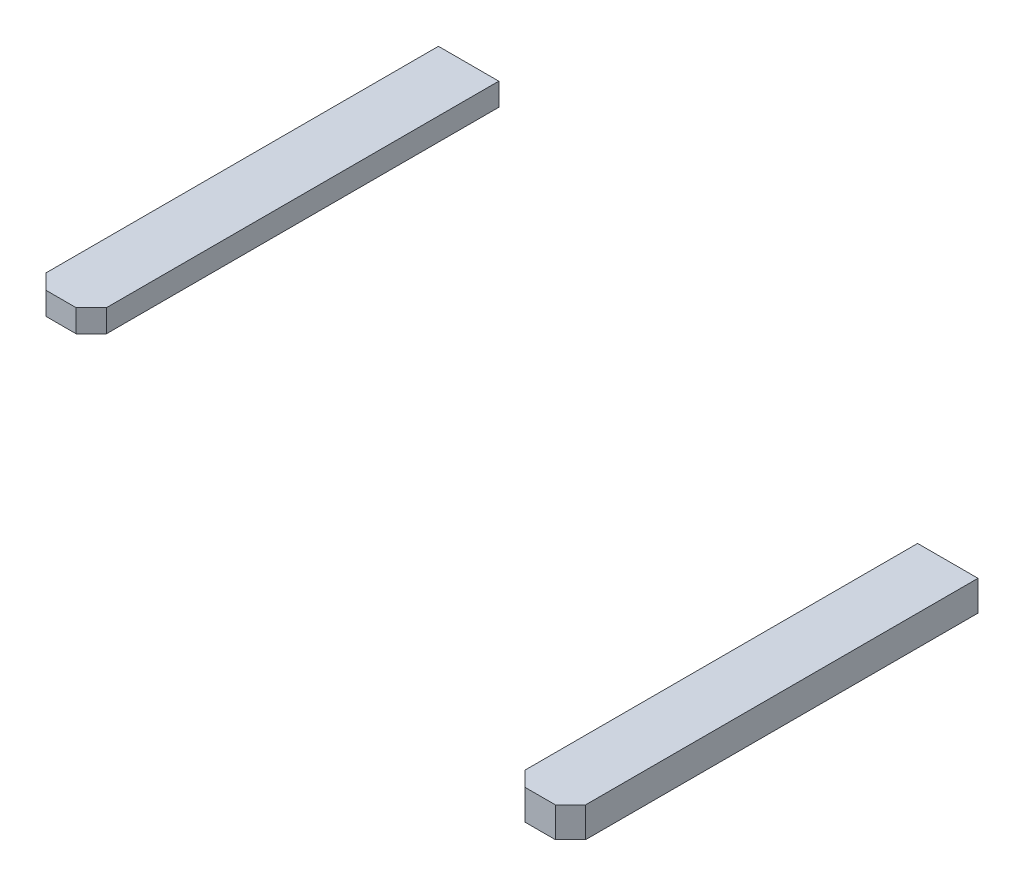
ISO-10303-21;
HEADER;
FILE_DESCRIPTION(('STEP AP214'),'2;1');
FILE_NAME('part.step','',(''),(''),'','','');
FILE_SCHEMA(('AUTOMOTIVE_DESIGN { 1 0 10303 214 1 1 1 1 }'));
ENDSEC;
DATA;
#1=APPLICATION_CONTEXT('core data for automotive mechanical design processes');
#2=APPLICATION_PROTOCOL_DEFINITION('international standard','automotive_design',2000,#1);
#3=PRODUCT_CONTEXT('',#1,'mechanical');
#4=PRODUCT('Part','Part','',(#3));
#5=PRODUCT_RELATED_PRODUCT_CATEGORY('part','',(#4));
#6=PRODUCT_DEFINITION_FORMATION('','',#4);
#7=PRODUCT_DEFINITION_CONTEXT('part definition',#1,'design');
#8=PRODUCT_DEFINITION('design','',#6,#7);
#9=PRODUCT_DEFINITION_SHAPE('','',#8);
#10=(LENGTH_UNIT() NAMED_UNIT(*) SI_UNIT(.MILLI.,.METRE.));
#11=(NAMED_UNIT(*) PLANE_ANGLE_UNIT() SI_UNIT($,.RADIAN.));
#12=(NAMED_UNIT(*) SI_UNIT($,.STERADIAN.) SOLID_ANGLE_UNIT());
#13=UNCERTAINTY_MEASURE_WITH_UNIT(LENGTH_MEASURE(1.E-05),#10,'distance_accuracy_value','');
#14=(GEOMETRIC_REPRESENTATION_CONTEXT(3) GLOBAL_UNCERTAINTY_ASSIGNED_CONTEXT((#13)) GLOBAL_UNIT_ASSIGNED_CONTEXT((#10,
#11,#12)) REPRESENTATION_CONTEXT('',''));
#15=CARTESIAN_POINT('',(0.,0.,0.));
#16=DIRECTION('',(0.,0.,1.));
#17=DIRECTION('',(1.,0.,0.));
#18=AXIS2_PLACEMENT_3D('',#15,#16,#17);
#19=CARTESIAN_POINT('',(-0.14,0.17,0.));
#20=DIRECTION('',(0.,0.,1.));
#21=DIRECTION('',(1.,0.,0.));
#22=AXIS2_PLACEMENT_3D('',#19,#20,#21);
#23=PLANE('',#22);
#24=DIRECTION('',(0.,-1.,0.));
#25=VECTOR('',#24,1.);
#26=CARTESIAN_POINT('',(0.26,0.32,0.));
#27=LINE('',#26,#25);
#28=CARTESIAN_POINT('',(0.26,0.32,0.));
#29=VERTEX_POINT('',#28);
#30=CARTESIAN_POINT('',(0.26,0.02,0.));
#31=VERTEX_POINT('',#30);
#32=EDGE_CURVE('P0_E11',#29,#31,#27,.T.);
#33=ORIENTED_EDGE('',*,*,#32,.T.);
#34=DIRECTION('',(-1.,0.,0.));
#35=VECTOR('',#34,1.);
#36=CARTESIAN_POINT('',(0.26,0.02,0.));
#37=LINE('',#36,#35);
#38=CARTESIAN_POINT('',(-0.54,0.02,0.));
#39=VERTEX_POINT('',#38);
#40=EDGE_CURVE('P0_E123',#31,#39,#37,.T.);
#41=ORIENTED_EDGE('',*,*,#40,.T.);
#42=DIRECTION('',(0.,1.,0.));
#43=VECTOR('',#42,1.);
#44=CARTESIAN_POINT('',(-0.54,0.02,0.));
#45=LINE('',#44,#43);
#46=CARTESIAN_POINT('',(-0.54,0.32,0.));
#47=VERTEX_POINT('',#46);
#48=EDGE_CURVE('P0_E131',#39,#47,#45,.T.);
#49=ORIENTED_EDGE('',*,*,#48,.T.);
#50=DIRECTION('',(1.,0.,0.));
#51=VECTOR('',#50,1.);
#52=CARTESIAN_POINT('',(-0.54,0.32,0.));
#53=LINE('',#52,#51);
#54=EDGE_CURVE('P0_E25',#47,#29,#53,.T.);
#55=ORIENTED_EDGE('',*,*,#54,.T.);
#56=EDGE_LOOP('',(#33,#41,#49,#55));
#57=FACE_BOUND('',#56,.T.);
#58=ADVANCED_FACE('P0_F17',(#57),#23,.F.);
#59=CARTESIAN_POINT('',(0.26,0.02,0.));
#60=DIRECTION('',(1.,0.,0.));
#61=DIRECTION('',(0.,1.,0.));
#62=AXIS2_PLACEMENT_3D('',#59,#60,#61);
#63=PLANE('',#62);
#64=DIRECTION('',(0.,1.,0.));
#65=VECTOR('',#64,1.);
#66=CARTESIAN_POINT('',(0.26,0.095,5.2));
#67=LINE('',#66,#65);
#68=CARTESIAN_POINT('',(0.26,0.02,5.2));
#69=VERTEX_POINT('',#68);
#70=CARTESIAN_POINT('',(0.26,0.32,5.2));
#71=VERTEX_POINT('',#70);
#72=EDGE_CURVE('P0_E114',#69,#71,#67,.T.);
#73=ORIENTED_EDGE('',*,*,#72,.F.);
#74=DIRECTION('',(0.,0.,1.));
#75=VECTOR('',#74,1.);
#76=CARTESIAN_POINT('',(0.26,0.02,0.));
#77=LINE('',#76,#75);
#78=EDGE_CURVE('P0_E126',#31,#69,#77,.T.);
#79=ORIENTED_EDGE('',*,*,#78,.F.);
#80=ORIENTED_EDGE('',*,*,#32,.F.);
#81=DIRECTION('',(0.,0.,1.));
#82=VECTOR('',#81,1.);
#83=CARTESIAN_POINT('',(0.26,0.32,0.));
#84=LINE('',#83,#82);
#85=EDGE_CURVE('P0_E133',#29,#71,#84,.T.);
#86=ORIENTED_EDGE('',*,*,#85,.T.);
#87=EDGE_LOOP('',(#73,#79,#80,#86));
#88=FACE_BOUND('',#87,.T.);
#89=ADVANCED_FACE('P0_F150',(#88),#63,.T.);
#90=CARTESIAN_POINT('',(0.26,0.32,0.));
#91=DIRECTION('',(0.,1.,0.));
#92=DIRECTION('',(1.,0.,0.));
#93=AXIS2_PLACEMENT_3D('',#90,#91,#92);
#94=PLANE('',#93);
#95=DIRECTION('',(-0.707106781186548,0.,0.707106781186548));
#96=VECTOR('',#95,1.);
#97=CARTESIAN_POINT('',(1.51,0.32,3.95));
#98=LINE('',#97,#96);
#99=CARTESIAN_POINT('',(0.06,0.32,5.4));
#100=VERTEX_POINT('',#99);
#101=EDGE_CURVE('P0_E148',#71,#100,#98,.T.);
#102=ORIENTED_EDGE('',*,*,#101,.F.);
#103=ORIENTED_EDGE('',*,*,#85,.F.);
#104=ORIENTED_EDGE('',*,*,#54,.F.);
#105=DIRECTION('',(0.,0.,1.));
#106=VECTOR('',#105,1.);
#107=CARTESIAN_POINT('',(-0.54,0.32,0.));
#108=LINE('',#107,#106);
#109=CARTESIAN_POINT('',(-0.54,0.32,5.2));
#110=VERTEX_POINT('',#109);
#111=EDGE_CURVE('P0_E134',#47,#110,#108,.T.);
#112=ORIENTED_EDGE('',*,*,#111,.T.);
#113=DIRECTION('',(-0.707106781186548,0.,-0.707106781186548));
#114=VECTOR('',#113,1.);
#115=CARTESIAN_POINT('',(-1.59,0.32,4.15));
#116=LINE('',#115,#114);
#117=CARTESIAN_POINT('',(-0.34,0.32,5.4));
#118=VERTEX_POINT('',#117);
#119=EDGE_CURVE('P0_E96',#118,#110,#116,.T.);
#120=ORIENTED_EDGE('',*,*,#119,.F.);
#121=DIRECTION('',(-1.,0.,0.));
#122=VECTOR('',#121,1.);
#123=CARTESIAN_POINT('',(-0.54,0.32,5.4));
#124=LINE('',#123,#122);
#125=EDGE_CURVE('P0_E92',#100,#118,#124,.T.);
#126=ORIENTED_EDGE('',*,*,#125,.F.);
#127=EDGE_LOOP('',(#102,#103,#104,#112,#120,#126));
#128=FACE_BOUND('',#127,.T.);
#129=ADVANCED_FACE('P0_F146',(#128),#94,.T.);
#130=CARTESIAN_POINT('',(-0.54,0.32,0.));
#131=DIRECTION('',(-1.,0.,0.));
#132=DIRECTION('',(0.,1.,0.));
#133=AXIS2_PLACEMENT_3D('',#130,#131,#132);
#134=PLANE('',#133);
#135=DIRECTION('',(0.,-1.,0.));
#136=VECTOR('',#135,1.);
#137=CARTESIAN_POINT('',(-0.54,0.245,5.2));
#138=LINE('',#137,#136);
#139=CARTESIAN_POINT('',(-0.54,0.02,5.2));
#140=VERTEX_POINT('',#139);
#141=EDGE_CURVE('P0_E102',#110,#140,#138,.T.);
#142=ORIENTED_EDGE('',*,*,#141,.F.);
#143=ORIENTED_EDGE('',*,*,#111,.F.);
#144=ORIENTED_EDGE('',*,*,#48,.F.);
#145=DIRECTION('',(0.,0.,1.));
#146=VECTOR('',#145,1.);
#147=CARTESIAN_POINT('',(-0.54,0.02,0.));
#148=LINE('',#147,#146);
#149=EDGE_CURVE('P0_E107',#39,#140,#148,.T.);
#150=ORIENTED_EDGE('',*,*,#149,.T.);
#151=EDGE_LOOP('',(#142,#143,#144,#150));
#152=FACE_BOUND('',#151,.T.);
#153=ADVANCED_FACE('P0_F166',(#152),#134,.T.);
#154=CARTESIAN_POINT('',(-0.44,0.245,5.3));
#155=DIRECTION('',(-0.707106781186548,0.,0.707106781186548));
#156=DIRECTION('',(0.,1.,0.));
#157=AXIS2_PLACEMENT_3D('',#154,#155,#156);
#158=PLANE('',#157);
#159=DIRECTION('',(0.707106781186548,0.,0.707106781186548));
#160=VECTOR('',#159,1.);
#161=CARTESIAN_POINT('',(-1.79,0.02,3.95));
#162=LINE('',#161,#160);
#163=CARTESIAN_POINT('',(-0.34,0.02,5.4));
#164=VERTEX_POINT('',#163);
#165=EDGE_CURVE('P0_E99',#140,#164,#162,.T.);
#166=ORIENTED_EDGE('',*,*,#165,.T.);
#167=DIRECTION('',(0.,1.,0.));
#168=VECTOR('',#167,1.);
#169=CARTESIAN_POINT('',(-0.34,0.245,5.4));
#170=LINE('',#169,#168);
#171=EDGE_CURVE('P0_E85',#164,#118,#170,.T.);
#172=ORIENTED_EDGE('',*,*,#171,.T.);
#173=ORIENTED_EDGE('',*,*,#119,.T.);
#174=ORIENTED_EDGE('',*,*,#141,.T.);
#175=EDGE_LOOP('',(#166,#172,#173,#174));
#176=FACE_BOUND('',#175,.T.);
#177=ADVANCED_FACE('P0_F100',(#176),#158,.T.);
#178=CARTESIAN_POINT('',(-0.14,0.17,5.4));
#179=DIRECTION('',(0.,0.,1.));
#180=DIRECTION('',(1.,0.,0.));
#181=AXIS2_PLACEMENT_3D('',#178,#179,#180);
#182=PLANE('',#181);
#183=DIRECTION('',(0.,-1.,0.));
#184=VECTOR('',#183,1.);
#185=CARTESIAN_POINT('',(0.06,0.095,5.4));
#186=LINE('',#185,#184);
#187=CARTESIAN_POINT('',(0.06,0.02,5.4));
#188=VERTEX_POINT('',#187);
#189=EDGE_CURVE('P0_E153',#100,#188,#186,.T.);
#190=ORIENTED_EDGE('',*,*,#189,.F.);
#191=ORIENTED_EDGE('',*,*,#125,.T.);
#192=ORIENTED_EDGE('',*,*,#171,.F.);
#193=DIRECTION('',(1.,0.,0.));
#194=VECTOR('',#193,1.);
#195=CARTESIAN_POINT('',(0.26,0.02,5.4));
#196=LINE('',#195,#194);
#197=EDGE_CURVE('P0_E90',#164,#188,#196,.T.);
#198=ORIENTED_EDGE('',*,*,#197,.T.);
#199=EDGE_LOOP('',(#190,#191,#192,#198));
#200=FACE_BOUND('',#199,.T.);
#201=ADVANCED_FACE('P0_F88',(#200),#182,.T.);
#202=CARTESIAN_POINT('',(-0.54,0.02,0.));
#203=DIRECTION('',(0.,-1.,0.));
#204=DIRECTION('',(0.,0.,-1.));
#205=AXIS2_PLACEMENT_3D('',#202,#203,#204);
#206=PLANE('',#205);
#207=DIRECTION('',(0.707106781186548,0.,-0.707106781186548));
#208=VECTOR('',#207,1.);
#209=CARTESIAN_POINT('',(1.31,0.02,4.15));
#210=LINE('',#209,#208);
#211=EDGE_CURVE('P0_E111',#188,#69,#210,.T.);
#212=ORIENTED_EDGE('',*,*,#211,.F.);
#213=ORIENTED_EDGE('',*,*,#197,.F.);
#214=ORIENTED_EDGE('',*,*,#165,.F.);
#215=ORIENTED_EDGE('',*,*,#149,.F.);
#216=ORIENTED_EDGE('',*,*,#40,.F.);
#217=ORIENTED_EDGE('',*,*,#78,.T.);
#218=EDGE_LOOP('',(#212,#213,#214,#215,#216,#217));
#219=FACE_BOUND('',#218,.T.);
#220=ADVANCED_FACE('P0_F109',(#219),#206,.T.);
#221=CARTESIAN_POINT('',(0.16,0.095,5.3));
#222=DIRECTION('',(0.707106781186548,0.,0.707106781186548));
#223=DIRECTION('',(0.,-1.,0.));
#224=AXIS2_PLACEMENT_3D('',#221,#222,#223);
#225=PLANE('',#224);
#226=ORIENTED_EDGE('',*,*,#101,.T.);
#227=ORIENTED_EDGE('',*,*,#189,.T.);
#228=ORIENTED_EDGE('',*,*,#211,.T.);
#229=ORIENTED_EDGE('',*,*,#72,.T.);
#230=EDGE_LOOP('',(#226,#227,#228,#229));
#231=FACE_BOUND('',#230,.T.);
#232=ADVANCED_FACE('P0_F152',(#231),#225,.T.);
#233=CLOSED_SHELL('',(#58,#89,#129,#153,#177,#201,#220,#232));
#234=MANIFOLD_SOLID_BREP('P0_B1',#233);
#235=CARTESIAN_POINT('',(6.21,-2.41,0.));
#236=DIRECTION('',(0.,0.,1.));
#237=DIRECTION('',(1.,0.,0.));
#238=AXIS2_PLACEMENT_3D('',#235,#236,#237);
#239=PLANE('',#238);
#240=DIRECTION('',(1.,0.,0.));
#241=VECTOR('',#240,1.);
#242=CARTESIAN_POINT('',(5.81,-2.21,0.));
#243=LINE('',#242,#241);
#244=CARTESIAN_POINT('',(5.81,-2.21,0.));
#245=VERTEX_POINT('',#244);
#246=CARTESIAN_POINT('',(6.61,-2.21,0.));
#247=VERTEX_POINT('',#246);
#248=EDGE_CURVE('P1_E125',#245,#247,#243,.T.);
#249=ORIENTED_EDGE('',*,*,#248,.T.);
#250=DIRECTION('',(0.,-1.,0.));
#251=VECTOR('',#250,1.);
#252=CARTESIAN_POINT('',(6.61,-2.21,0.));
#253=LINE('',#252,#251);
#254=CARTESIAN_POINT('',(6.61,-2.61,0.));
#255=VERTEX_POINT('',#254);
#256=EDGE_CURVE('P1_E20',#247,#255,#253,.T.);
#257=ORIENTED_EDGE('',*,*,#256,.T.);
#258=DIRECTION('',(-1.,0.,0.));
#259=VECTOR('',#258,1.);
#260=CARTESIAN_POINT('',(6.61,-2.61,0.));
#261=LINE('',#260,#259);
#262=CARTESIAN_POINT('',(5.81,-2.61,0.));
#263=VERTEX_POINT('',#262);
#264=EDGE_CURVE('P1_E109',#255,#263,#261,.T.);
#265=ORIENTED_EDGE('',*,*,#264,.T.);
#266=DIRECTION('',(0.,1.,0.));
#267=VECTOR('',#266,1.);
#268=CARTESIAN_POINT('',(5.81,-2.61,0.));
#269=LINE('',#268,#267);
#270=EDGE_CURVE('P1_E11',#263,#245,#269,.T.);
#271=ORIENTED_EDGE('',*,*,#270,.T.);
#272=EDGE_LOOP('',(#249,#257,#265,#271));
#273=FACE_BOUND('',#272,.T.);
#274=ADVANCED_FACE('P1_F17',(#273),#239,.F.);
#275=CARTESIAN_POINT('',(5.81,-2.21,0.));
#276=DIRECTION('',(-1.,0.,0.));
#277=DIRECTION('',(0.,0.,1.));
#278=AXIS2_PLACEMENT_3D('',#275,#276,#277);
#279=PLANE('',#278);
#280=DIRECTION('',(0.,-1.,0.));
#281=VECTOR('',#280,1.);
#282=CARTESIAN_POINT('',(5.81,-2.31,5.2));
#283=LINE('',#282,#281);
#284=CARTESIAN_POINT('',(5.81,-2.21,5.2));
#285=VERTEX_POINT('',#284);
#286=CARTESIAN_POINT('',(5.81,-2.61,5.2));
#287=VERTEX_POINT('',#286);
#288=EDGE_CURVE('P1_E133',#285,#287,#283,.T.);
#289=ORIENTED_EDGE('',*,*,#288,.F.);
#290=DIRECTION('',(0.,0.,1.));
#291=VECTOR('',#290,1.);
#292=CARTESIAN_POINT('',(5.81,-2.21,0.));
#293=LINE('',#292,#291);
#294=EDGE_CURVE('P1_E122',#245,#285,#293,.T.);
#295=ORIENTED_EDGE('',*,*,#294,.F.);
#296=ORIENTED_EDGE('',*,*,#270,.F.);
#297=DIRECTION('',(0.,0.,1.));
#298=VECTOR('',#297,1.);
#299=CARTESIAN_POINT('',(5.81,-2.61,0.));
#300=LINE('',#299,#298);
#301=EDGE_CURVE('P1_E115',#263,#287,#300,.T.);
#302=ORIENTED_EDGE('',*,*,#301,.T.);
#303=EDGE_LOOP('',(#289,#295,#296,#302));
#304=FACE_BOUND('',#303,.T.);
#305=ADVANCED_FACE('P1_F165',(#304),#279,.T.);
#306=CARTESIAN_POINT('',(6.61,-2.61,0.));
#307=DIRECTION('',(1.,0.,0.));
#308=DIRECTION('',(0.,1.,0.));
#309=AXIS2_PLACEMENT_3D('',#306,#307,#308);
#310=PLANE('',#309);
#311=DIRECTION('',(0.,1.,0.));
#312=VECTOR('',#311,1.);
#313=CARTESIAN_POINT('',(6.61,-2.51,5.2));
#314=LINE('',#313,#312);
#315=CARTESIAN_POINT('',(6.61,-2.61,5.2));
#316=VERTEX_POINT('',#315);
#317=CARTESIAN_POINT('',(6.61,-2.21,5.2));
#318=VERTEX_POINT('',#317);
#319=EDGE_CURVE('P1_E84',#316,#318,#314,.T.);
#320=ORIENTED_EDGE('',*,*,#319,.F.);
#321=DIRECTION('',(0.,0.,1.));
#322=VECTOR('',#321,1.);
#323=CARTESIAN_POINT('',(6.61,-2.61,0.));
#324=LINE('',#323,#322);
#325=EDGE_CURVE('P1_E88',#255,#316,#324,.T.);
#326=ORIENTED_EDGE('',*,*,#325,.F.);
#327=ORIENTED_EDGE('',*,*,#256,.F.);
#328=DIRECTION('',(0.,0.,1.));
#329=VECTOR('',#328,1.);
#330=CARTESIAN_POINT('',(6.61,-2.21,0.));
#331=LINE('',#330,#329);
#332=EDGE_CURVE('P1_E91',#247,#318,#331,.T.);
#333=ORIENTED_EDGE('',*,*,#332,.T.);
#334=EDGE_LOOP('',(#320,#326,#327,#333));
#335=FACE_BOUND('',#334,.T.);
#336=ADVANCED_FACE('P1_F86',(#335),#310,.T.);
#337=CARTESIAN_POINT('',(6.61,-2.21,0.));
#338=DIRECTION('',(0.,1.,0.));
#339=DIRECTION('',(1.,0.,0.));
#340=AXIS2_PLACEMENT_3D('',#337,#338,#339);
#341=PLANE('',#340);
#342=DIRECTION('',(-0.707106781186548,0.,-0.707106781186548));
#343=VECTOR('',#342,1.);
#344=CARTESIAN_POINT('',(4.76,-2.21,4.15));
#345=LINE('',#344,#343);
#346=CARTESIAN_POINT('',(6.01,-2.21,5.4));
#347=VERTEX_POINT('',#346);
#348=EDGE_CURVE('P1_E128',#347,#285,#345,.T.);
#349=ORIENTED_EDGE('',*,*,#348,.F.);
#350=DIRECTION('',(-1.,0.,0.));
#351=VECTOR('',#350,1.);
#352=CARTESIAN_POINT('',(5.81,-2.21,5.4));
#353=LINE('',#352,#351);
#354=CARTESIAN_POINT('',(6.41,-2.21,5.4));
#355=VERTEX_POINT('',#354);
#356=EDGE_CURVE('P1_E142',#355,#347,#353,.T.);
#357=ORIENTED_EDGE('',*,*,#356,.F.);
#358=DIRECTION('',(-0.707106781186548,0.,0.707106781186548));
#359=VECTOR('',#358,1.);
#360=CARTESIAN_POINT('',(7.86,-2.21,3.95));
#361=LINE('',#360,#359);
#362=EDGE_CURVE('P1_E95',#318,#355,#361,.T.);
#363=ORIENTED_EDGE('',*,*,#362,.F.);
#364=ORIENTED_EDGE('',*,*,#332,.F.);
#365=ORIENTED_EDGE('',*,*,#248,.F.);
#366=ORIENTED_EDGE('',*,*,#294,.T.);
#367=EDGE_LOOP('',(#349,#357,#363,#364,#365,#366));
#368=FACE_BOUND('',#367,.T.);
#369=ADVANCED_FACE('P1_F156',(#368),#341,.T.);
#370=CARTESIAN_POINT('',(6.51,-2.51,5.3));
#371=DIRECTION('',(0.707106781186548,0.,0.707106781186548));
#372=DIRECTION('',(0.,-1.,0.));
#373=AXIS2_PLACEMENT_3D('',#370,#371,#372);
#374=PLANE('',#373);
#375=ORIENTED_EDGE('',*,*,#362,.T.);
#376=DIRECTION('',(0.,-1.,0.));
#377=VECTOR('',#376,1.);
#378=CARTESIAN_POINT('',(6.41,-2.51,5.4));
#379=LINE('',#378,#377);
#380=CARTESIAN_POINT('',(6.41,-2.61,5.4));
#381=VERTEX_POINT('',#380);
#382=EDGE_CURVE('P1_E101',#355,#381,#379,.T.);
#383=ORIENTED_EDGE('',*,*,#382,.T.);
#384=DIRECTION('',(0.707106781186548,0.,-0.707106781186548));
#385=VECTOR('',#384,1.);
#386=CARTESIAN_POINT('',(7.66,-2.61,4.15));
#387=LINE('',#386,#385);
#388=EDGE_CURVE('P1_E98',#381,#316,#387,.T.);
#389=ORIENTED_EDGE('',*,*,#388,.T.);
#390=ORIENTED_EDGE('',*,*,#319,.T.);
#391=EDGE_LOOP('',(#375,#383,#389,#390));
#392=FACE_BOUND('',#391,.T.);
#393=ADVANCED_FACE('P1_F99',(#392),#374,.T.);
#394=CARTESIAN_POINT('',(5.81,-2.61,0.));
#395=DIRECTION('',(0.,-1.,0.));
#396=DIRECTION('',(0.,0.,-1.));
#397=AXIS2_PLACEMENT_3D('',#394,#395,#396);
#398=PLANE('',#397);
#399=DIRECTION('',(0.707106781186548,0.,0.707106781186548));
#400=VECTOR('',#399,1.);
#401=CARTESIAN_POINT('',(4.56,-2.61,3.95));
#402=LINE('',#401,#400);
#403=CARTESIAN_POINT('',(6.01,-2.61,5.4));
#404=VERTEX_POINT('',#403);
#405=EDGE_CURVE('P1_E118',#287,#404,#402,.T.);
#406=ORIENTED_EDGE('',*,*,#405,.F.);
#407=ORIENTED_EDGE('',*,*,#301,.F.);
#408=ORIENTED_EDGE('',*,*,#264,.F.);
#409=ORIENTED_EDGE('',*,*,#325,.T.);
#410=ORIENTED_EDGE('',*,*,#388,.F.);
#411=DIRECTION('',(1.,0.,0.));
#412=VECTOR('',#411,1.);
#413=CARTESIAN_POINT('',(6.61,-2.61,5.4));
#414=LINE('',#413,#412);
#415=EDGE_CURVE('P1_E137',#404,#381,#414,.T.);
#416=ORIENTED_EDGE('',*,*,#415,.F.);
#417=EDGE_LOOP('',(#406,#407,#408,#409,#410,#416));
#418=FACE_BOUND('',#417,.T.);
#419=ADVANCED_FACE('P1_F107',(#418),#398,.T.);
#420=CARTESIAN_POINT('',(6.21,-2.41,5.4));
#421=DIRECTION('',(0.,0.,1.));
#422=DIRECTION('',(1.,0.,0.));
#423=AXIS2_PLACEMENT_3D('',#420,#421,#422);
#424=PLANE('',#423);
#425=DIRECTION('',(0.,1.,0.));
#426=VECTOR('',#425,1.);
#427=CARTESIAN_POINT('',(6.01,-2.31,5.4));
#428=LINE('',#427,#426);
#429=EDGE_CURVE('P1_E121',#404,#347,#428,.T.);
#430=ORIENTED_EDGE('',*,*,#429,.F.);
#431=ORIENTED_EDGE('',*,*,#415,.T.);
#432=ORIENTED_EDGE('',*,*,#382,.F.);
#433=ORIENTED_EDGE('',*,*,#356,.T.);
#434=EDGE_LOOP('',(#430,#431,#432,#433));
#435=FACE_BOUND('',#434,.T.);
#436=ADVANCED_FACE('P1_F160',(#435),#424,.T.);
#437=CARTESIAN_POINT('',(5.91,-2.31,5.3));
#438=DIRECTION('',(-0.707106781186548,0.,0.707106781186548));
#439=DIRECTION('',(0.,1.,0.));
#440=AXIS2_PLACEMENT_3D('',#437,#438,#439);
#441=PLANE('',#440);
#442=ORIENTED_EDGE('',*,*,#405,.T.);
#443=ORIENTED_EDGE('',*,*,#429,.T.);
#444=ORIENTED_EDGE('',*,*,#348,.T.);
#445=ORIENTED_EDGE('',*,*,#288,.T.);
#446=EDGE_LOOP('',(#442,#443,#444,#445));
#447=FACE_BOUND('',#446,.T.);
#448=ADVANCED_FACE('P1_F162',(#447),#441,.T.);
#449=CLOSED_SHELL('',(#274,#305,#336,#369,#393,#419,#436,#448));
#450=MANIFOLD_SOLID_BREP('P1_B1',#449);
#451=ADVANCED_BREP_SHAPE_REPRESENTATION('',(#18,#234,#450),#14);
#452=SHAPE_DEFINITION_REPRESENTATION(#9,#451);
ENDSEC;
END-ISO-10303-21;
